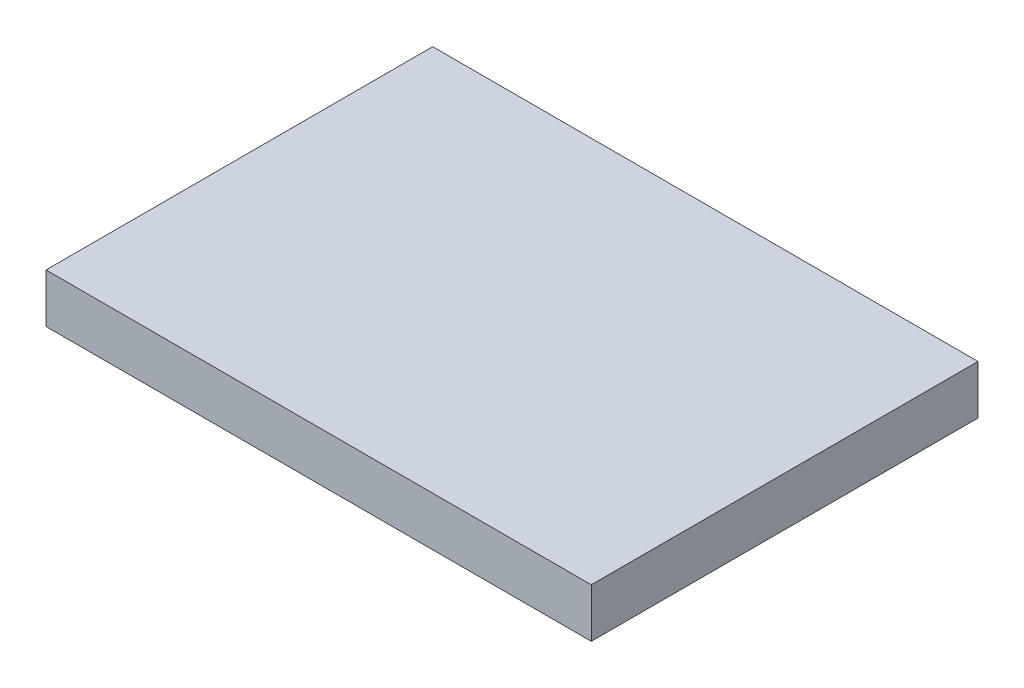
ISO-10303-21;
HEADER;
FILE_DESCRIPTION(('STEP AP214'),'2;1');
FILE_NAME('part.step','',(''),(''),'','','');
FILE_SCHEMA(('AUTOMOTIVE_DESIGN { 1 0 10303 214 1 1 1 1 }'));
ENDSEC;
DATA;
#1=APPLICATION_CONTEXT('core data for automotive mechanical design processes');
#2=APPLICATION_PROTOCOL_DEFINITION('international standard','automotive_design',2000,#1);
#3=PRODUCT_CONTEXT('',#1,'mechanical');
#4=PRODUCT('Part','Part','',(#3));
#5=PRODUCT_RELATED_PRODUCT_CATEGORY('part','',(#4));
#6=PRODUCT_DEFINITION_FORMATION('','',#4);
#7=PRODUCT_DEFINITION_CONTEXT('part definition',#1,'design');
#8=PRODUCT_DEFINITION('design','',#6,#7);
#9=PRODUCT_DEFINITION_SHAPE('','',#8);
#10=(LENGTH_UNIT() NAMED_UNIT(*) SI_UNIT(.MILLI.,.METRE.));
#11=(NAMED_UNIT(*) PLANE_ANGLE_UNIT() SI_UNIT($,.RADIAN.));
#12=(NAMED_UNIT(*) SI_UNIT($,.STERADIAN.) SOLID_ANGLE_UNIT());
#13=UNCERTAINTY_MEASURE_WITH_UNIT(LENGTH_MEASURE(1.E-05),#10,'distance_accuracy_value','');
#14=(GEOMETRIC_REPRESENTATION_CONTEXT(3) GLOBAL_UNCERTAINTY_ASSIGNED_CONTEXT((#13)) GLOBAL_UNIT_ASSIGNED_CONTEXT((#10,
#11,#12)) REPRESENTATION_CONTEXT('',''));
#15=CARTESIAN_POINT('',(0.,0.,0.));
#16=DIRECTION('',(0.,0.,1.));
#17=DIRECTION('',(1.,0.,0.));
#18=AXIS2_PLACEMENT_3D('',#15,#16,#17);
#19=CARTESIAN_POINT('',(-39.6473912328474,-7.3067615880529,30.));
#20=DIRECTION('',(1.,0.,0.));
#21=DIRECTION('',(0.,0.,-1.));
#22=AXIS2_PLACEMENT_3D('',#19,#20,#21);
#23=PLANE('',#22);
#24=DIRECTION('',(0.,-1.,0.));
#25=VECTOR('',#24,1.);
#26=CARTESIAN_POINT('',(-39.6473912328474,-7.3067615880529,0.));
#27=LINE('',#26,#25);
#28=CARTESIAN_POINT('',(-39.6473912328474,-7.3067615880529,0.));
#29=VERTEX_POINT('',#28);
#30=CARTESIAN_POINT('',(-39.6473912328474,-11.1067615880529,0.));
#31=VERTEX_POINT('',#30);
#32=EDGE_CURVE('E93',#29,#31,#27,.T.);
#33=ORIENTED_EDGE('',*,*,#32,.T.);
#34=DIRECTION('',(0.,0.,-1.));
#35=VECTOR('',#34,1.);
#36=CARTESIAN_POINT('',(-39.6473912328474,-11.1067615880529,30.));
#37=LINE('',#36,#35);
#38=CARTESIAN_POINT('',(-39.6473912328474,-11.1067615880529,30.));
#39=VERTEX_POINT('',#38);
#40=EDGE_CURVE('E11',#39,#31,#37,.T.);
#41=ORIENTED_EDGE('',*,*,#40,.F.);
#42=DIRECTION('',(0.,-1.,0.));
#43=VECTOR('',#42,1.);
#44=CARTESIAN_POINT('',(-39.6473912328474,-7.3067615880529,30.));
#45=LINE('',#44,#43);
#46=CARTESIAN_POINT('',(-39.6473912328474,-7.3067615880529,30.));
#47=VERTEX_POINT('',#46);
#48=EDGE_CURVE('E81',#47,#39,#45,.T.);
#49=ORIENTED_EDGE('',*,*,#48,.F.);
#50=DIRECTION('',(0.,0.,-1.));
#51=VECTOR('',#50,1.);
#52=CARTESIAN_POINT('',(-39.6473912328474,-7.3067615880529,30.));
#53=LINE('',#52,#51);
#54=EDGE_CURVE('E89',#47,#29,#53,.T.);
#55=ORIENTED_EDGE('',*,*,#54,.T.);
#56=EDGE_LOOP('',(#33,#41,#49,#55));
#57=FACE_BOUND('',#56,.T.);
#58=ADVANCED_FACE('F30',(#57),#23,.F.);
#59=CARTESIAN_POINT('',(-39.6473912328474,-11.1067615880529,30.));
#60=DIRECTION('',(0.,1.,0.));
#61=DIRECTION('',(0.,0.,1.));
#62=AXIS2_PLACEMENT_3D('',#59,#60,#61);
#63=PLANE('',#62);
#64=DIRECTION('',(1.,0.,0.));
#65=VECTOR('',#64,1.);
#66=CARTESIAN_POINT('',(-39.6473912328474,-11.1067615880529,0.));
#67=LINE('',#66,#65);
#68=CARTESIAN_POINT('',(2.65260876715256,-11.1067615880529,0.));
#69=VERTEX_POINT('',#68);
#70=EDGE_CURVE('E85',#31,#69,#67,.T.);
#71=ORIENTED_EDGE('',*,*,#70,.T.);
#72=DIRECTION('',(0.,0.,-1.));
#73=VECTOR('',#72,1.);
#74=CARTESIAN_POINT('',(2.65260876715256,-11.1067615880529,30.));
#75=LINE('',#74,#73);
#76=CARTESIAN_POINT('',(2.65260876715256,-11.1067615880529,30.));
#77=VERTEX_POINT('',#76);
#78=EDGE_CURVE('E38',#77,#69,#75,.T.);
#79=ORIENTED_EDGE('',*,*,#78,.F.);
#80=DIRECTION('',(1.,0.,0.));
#81=VECTOR('',#80,1.);
#82=CARTESIAN_POINT('',(-39.6473912328474,-11.1067615880529,30.));
#83=LINE('',#82,#81);
#84=EDGE_CURVE('E76',#39,#77,#83,.T.);
#85=ORIENTED_EDGE('',*,*,#84,.F.);
#86=ORIENTED_EDGE('',*,*,#40,.T.);
#87=EDGE_LOOP('',(#71,#79,#85,#86));
#88=FACE_BOUND('',#87,.T.);
#89=ADVANCED_FACE('F84',(#88),#63,.F.);
#90=CARTESIAN_POINT('',(2.65260876715256,-7.3067615880529,30.));
#91=DIRECTION('',(-1.,0.,0.));
#92=DIRECTION('',(0.,0.,1.));
#93=AXIS2_PLACEMENT_3D('',#90,#91,#92);
#94=PLANE('',#93);
#95=DIRECTION('',(0.,1.,0.));
#96=VECTOR('',#95,1.);
#97=CARTESIAN_POINT('',(2.65260876715256,-7.3067615880529,0.));
#98=LINE('',#97,#96);
#99=CARTESIAN_POINT('',(2.65260876715256,-7.3067615880529,0.));
#100=VERTEX_POINT('',#99);
#101=EDGE_CURVE('E63',#69,#100,#98,.T.);
#102=ORIENTED_EDGE('',*,*,#101,.T.);
#103=DIRECTION('',(0.,0.,-1.));
#104=VECTOR('',#103,1.);
#105=CARTESIAN_POINT('',(2.65260876715256,-7.3067615880529,30.));
#106=LINE('',#105,#104);
#107=CARTESIAN_POINT('',(2.65260876715256,-7.3067615880529,30.));
#108=VERTEX_POINT('',#107);
#109=EDGE_CURVE('E86',#108,#100,#106,.T.);
#110=ORIENTED_EDGE('',*,*,#109,.F.);
#111=DIRECTION('',(0.,1.,0.));
#112=VECTOR('',#111,1.);
#113=CARTESIAN_POINT('',(2.65260876715256,-7.3067615880529,30.));
#114=LINE('',#113,#112);
#115=EDGE_CURVE('E79',#77,#108,#114,.T.);
#116=ORIENTED_EDGE('',*,*,#115,.F.);
#117=ORIENTED_EDGE('',*,*,#78,.T.);
#118=EDGE_LOOP('',(#102,#110,#116,#117));
#119=FACE_BOUND('',#118,.T.);
#120=ADVANCED_FACE('F87',(#119),#94,.F.);
#121=CARTESIAN_POINT('',(-39.6473912328474,-7.3067615880529,30.));
#122=DIRECTION('',(0.,-1.,0.));
#123=DIRECTION('',(0.,0.,-1.));
#124=AXIS2_PLACEMENT_3D('',#121,#122,#123);
#125=PLANE('',#124);
#126=DIRECTION('',(-1.,0.,0.));
#127=VECTOR('',#126,1.);
#128=CARTESIAN_POINT('',(-39.6473912328474,-7.3067615880529,0.));
#129=LINE('',#128,#127);
#130=EDGE_CURVE('E69',#100,#29,#129,.T.);
#131=ORIENTED_EDGE('',*,*,#130,.T.);
#132=ORIENTED_EDGE('',*,*,#54,.F.);
#133=DIRECTION('',(-1.,0.,0.));
#134=VECTOR('',#133,1.);
#135=CARTESIAN_POINT('',(-39.6473912328474,-7.3067615880529,30.));
#136=LINE('',#135,#134);
#137=EDGE_CURVE('E46',#108,#47,#136,.T.);
#138=ORIENTED_EDGE('',*,*,#137,.F.);
#139=ORIENTED_EDGE('',*,*,#109,.T.);
#140=EDGE_LOOP('',(#131,#132,#138,#139));
#141=FACE_BOUND('',#140,.T.);
#142=ADVANCED_FACE('F100',(#141),#125,.F.);
#143=CARTESIAN_POINT('',(-39.6473912328474,-11.1067615880529,30.));
#144=DIRECTION('',(0.,0.,1.));
#145=DIRECTION('',(1.,0.,0.));
#146=AXIS2_PLACEMENT_3D('',#143,#144,#145);
#147=PLANE('',#146);
#148=ORIENTED_EDGE('',*,*,#48,.T.);
#149=ORIENTED_EDGE('',*,*,#84,.T.);
#150=ORIENTED_EDGE('',*,*,#115,.T.);
#151=ORIENTED_EDGE('',*,*,#137,.T.);
#152=EDGE_LOOP('',(#148,#149,#150,#151));
#153=FACE_BOUND('',#152,.T.);
#154=ADVANCED_FACE('F77',(#153),#147,.T.);
#155=CARTESIAN_POINT('',(-39.6473912328474,-11.1067615880529,0.));
#156=DIRECTION('',(0.,0.,1.));
#157=DIRECTION('',(1.,0.,0.));
#158=AXIS2_PLACEMENT_3D('',#155,#156,#157);
#159=PLANE('',#158);
#160=ORIENTED_EDGE('',*,*,#32,.F.);
#161=ORIENTED_EDGE('',*,*,#130,.F.);
#162=ORIENTED_EDGE('',*,*,#101,.F.);
#163=ORIENTED_EDGE('',*,*,#70,.F.);
#164=EDGE_LOOP('',(#160,#161,#162,#163));
#165=FACE_BOUND('',#164,.T.);
#166=ADVANCED_FACE('F103',(#165),#159,.F.);
#167=CLOSED_SHELL('',(#58,#89,#120,#142,#154,#166));
#168=MANIFOLD_SOLID_BREP('B2',#167);
#169=ADVANCED_BREP_SHAPE_REPRESENTATION('',(#18,#168),#14);
#170=SHAPE_DEFINITION_REPRESENTATION(#9,#169);
ENDSEC;
END-ISO-10303-21;
